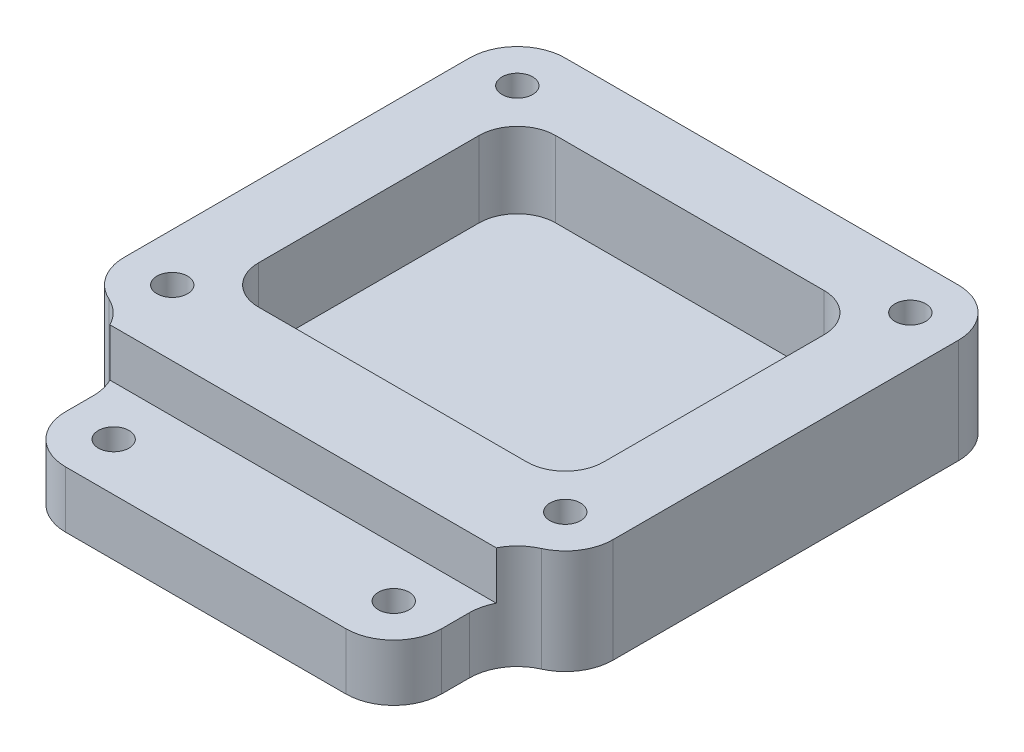
ISO-10303-21;
HEADER;
FILE_DESCRIPTION(('STEP AP214'),'2;1');
FILE_NAME('part.step','',(''),(''),'','','');
FILE_SCHEMA(('AUTOMOTIVE_DESIGN { 1 0 10303 214 1 1 1 1 }'));
ENDSEC;
DATA;
#1=APPLICATION_CONTEXT('core data for automotive mechanical design processes');
#2=APPLICATION_PROTOCOL_DEFINITION('international standard','automotive_design',2000,#1);
#3=PRODUCT_CONTEXT('',#1,'mechanical');
#4=PRODUCT('Part','Part','',(#3));
#5=PRODUCT_RELATED_PRODUCT_CATEGORY('part','',(#4));
#6=PRODUCT_DEFINITION_FORMATION('','',#4);
#7=PRODUCT_DEFINITION_CONTEXT('part definition',#1,'design');
#8=PRODUCT_DEFINITION('design','',#6,#7);
#9=PRODUCT_DEFINITION_SHAPE('','',#8);
#10=(LENGTH_UNIT() NAMED_UNIT(*) SI_UNIT(.MILLI.,.METRE.));
#11=(NAMED_UNIT(*) PLANE_ANGLE_UNIT() SI_UNIT($,.RADIAN.));
#12=(NAMED_UNIT(*) SI_UNIT($,.STERADIAN.) SOLID_ANGLE_UNIT());
#13=UNCERTAINTY_MEASURE_WITH_UNIT(LENGTH_MEASURE(1.E-05),#10,'distance_accuracy_value','');
#14=(GEOMETRIC_REPRESENTATION_CONTEXT(3) GLOBAL_UNCERTAINTY_ASSIGNED_CONTEXT((#13)) GLOBAL_UNIT_ASSIGNED_CONTEXT((#10,
#11,#12)) REPRESENTATION_CONTEXT('',''));
#15=CARTESIAN_POINT('',(0.,0.,0.));
#16=DIRECTION('',(0.,0.,1.));
#17=DIRECTION('',(1.,0.,0.));
#18=AXIS2_PLACEMENT_3D('',#15,#16,#17);
#19=CARTESIAN_POINT('',(-19.61,10.9,0.));
#20=DIRECTION('',(-1.,0.,0.));
#21=DIRECTION('',(0.,0.,1.));
#22=AXIS2_PLACEMENT_3D('',#19,#20,#21);
#23=PLANE('',#22);
#24=DIRECTION('',(0.,0.,1.));
#25=VECTOR('',#24,1.);
#26=CARTESIAN_POINT('',(-19.61,5.9,35.15));
#27=LINE('',#26,#25);
#28=CARTESIAN_POINT('',(-19.61,5.9,27.1163534376416));
#29=VERTEX_POINT('',#28);
#30=CARTESIAN_POINT('',(-19.61,5.9,30.));
#31=VERTEX_POINT('',#30);
#32=EDGE_CURVE('E413',#29,#31,#27,.T.);
#33=ORIENTED_EDGE('',*,*,#32,.F.);
#34=DIRECTION('',(0.,-1.,0.));
#35=VECTOR('',#34,1.);
#36=CARTESIAN_POINT('',(-19.61,0.,27.1163534376416));
#37=LINE('',#36,#35);
#38=CARTESIAN_POINT('',(-19.61,0.,27.1163534376416));
#39=VERTEX_POINT('',#38);
#40=EDGE_CURVE('E310',#29,#39,#37,.T.);
#41=ORIENTED_EDGE('',*,*,#40,.T.);
#42=DIRECTION('',(0.,0.,-1.));
#43=VECTOR('',#42,1.);
#44=CARTESIAN_POINT('',(-19.61,0.,0.));
#45=LINE('',#44,#43);
#46=CARTESIAN_POINT('',(-19.61,0.,30.));
#47=VERTEX_POINT('',#46);
#48=EDGE_CURVE('E403',#47,#39,#45,.T.);
#49=ORIENTED_EDGE('',*,*,#48,.F.);
#50=DIRECTION('',(0.,-1.,0.));
#51=VECTOR('',#50,1.);
#52=CARTESIAN_POINT('',(-19.61,5.9,30.));
#53=LINE('',#52,#51);
#54=EDGE_CURVE('E207',#47,#31,#53,.F.);
#55=ORIENTED_EDGE('',*,*,#54,.T.);
#56=EDGE_LOOP('',(#33,#41,#49,#55));
#57=FACE_BOUND('',#56,.T.);
#58=ADVANCED_FACE('F36',(#57),#23,.T.);
#59=CARTESIAN_POINT('',(0.,10.9,35.));
#60=DIRECTION('',(0.,0.,-1.));
#61=DIRECTION('',(-1.,0.,0.));
#62=AXIS2_PLACEMENT_3D('',#59,#60,#61);
#63=PLANE('',#62);
#64=DIRECTION('',(1.,0.,0.));
#65=VECTOR('',#64,1.);
#66=CARTESIAN_POINT('',(0.,0.,35.));
#67=LINE('',#66,#65);
#68=CARTESIAN_POINT('',(-14.61,0.,35.));
#69=VERTEX_POINT('',#68);
#70=CARTESIAN_POINT('',(14.61,0.,35.));
#71=VERTEX_POINT('',#70);
#72=EDGE_CURVE('E360',#69,#71,#67,.T.);
#73=ORIENTED_EDGE('',*,*,#72,.T.);
#74=DIRECTION('',(0.,-1.,0.));
#75=VECTOR('',#74,1.);
#76=CARTESIAN_POINT('',(14.61,10.9,35.));
#77=LINE('',#76,#75);
#78=CARTESIAN_POINT('',(14.61,5.9,35.));
#79=VERTEX_POINT('',#78);
#80=EDGE_CURVE('E245',#71,#79,#77,.F.);
#81=ORIENTED_EDGE('',*,*,#80,.T.);
#82=DIRECTION('',(-1.,0.,0.));
#83=VECTOR('',#82,1.);
#84=CARTESIAN_POINT('',(0.,5.9,35.));
#85=LINE('',#84,#83);
#86=CARTESIAN_POINT('',(-14.61,5.9,35.));
#87=VERTEX_POINT('',#86);
#88=EDGE_CURVE('E203',#79,#87,#85,.T.);
#89=ORIENTED_EDGE('',*,*,#88,.T.);
#90=DIRECTION('',(0.,-1.,0.));
#91=VECTOR('',#90,1.);
#92=CARTESIAN_POINT('',(-14.61,0.,35.));
#93=LINE('',#92,#91);
#94=EDGE_CURVE('E242',#87,#69,#93,.T.);
#95=ORIENTED_EDGE('',*,*,#94,.T.);
#96=EDGE_LOOP('',(#73,#81,#89,#95));
#97=FACE_BOUND('',#96,.T.);
#98=ADVANCED_FACE('F408',(#97),#63,.F.);
#99=CARTESIAN_POINT('',(19.61,10.9,0.));
#100=DIRECTION('',(-1.,0.,0.));
#101=DIRECTION('',(0.,0.,1.));
#102=AXIS2_PLACEMENT_3D('',#99,#100,#101);
#103=PLANE('',#102);
#104=DIRECTION('',(0.,0.,-1.));
#105=VECTOR('',#104,1.);
#106=CARTESIAN_POINT('',(19.61,0.,0.));
#107=LINE('',#106,#105);
#108=CARTESIAN_POINT('',(19.61,0.,30.));
#109=VERTEX_POINT('',#108);
#110=CARTESIAN_POINT('',(19.61,0.,27.1163534376416));
#111=VERTEX_POINT('',#110);
#112=EDGE_CURVE('E356',#109,#111,#107,.T.);
#113=ORIENTED_EDGE('',*,*,#112,.T.);
#114=DIRECTION('',(0.,-1.,0.));
#115=VECTOR('',#114,1.);
#116=CARTESIAN_POINT('',(19.61,10.9,27.1163534376416));
#117=LINE('',#116,#115);
#118=CARTESIAN_POINT('',(19.61,5.9,27.1163534376416));
#119=VERTEX_POINT('',#118);
#120=EDGE_CURVE('E217',#111,#119,#117,.F.);
#121=ORIENTED_EDGE('',*,*,#120,.T.);
#122=DIRECTION('',(0.,0.,-1.));
#123=VECTOR('',#122,1.);
#124=CARTESIAN_POINT('',(19.61,5.9,35.15));
#125=LINE('',#124,#123);
#126=CARTESIAN_POINT('',(19.61,5.9,30.));
#127=VERTEX_POINT('',#126);
#128=EDGE_CURVE('E200',#127,#119,#125,.T.);
#129=ORIENTED_EDGE('',*,*,#128,.F.);
#130=DIRECTION('',(0.,-1.,0.));
#131=VECTOR('',#130,1.);
#132=CARTESIAN_POINT('',(19.61,10.9,30.));
#133=LINE('',#132,#131);
#134=EDGE_CURVE('E214',#127,#109,#133,.T.);
#135=ORIENTED_EDGE('',*,*,#134,.T.);
#136=EDGE_LOOP('',(#113,#121,#129,#135));
#137=FACE_BOUND('',#136,.T.);
#138=ADVANCED_FACE('F213',(#137),#103,.F.);
#139=CARTESIAN_POINT('',(25.5,10.9,0.));
#140=DIRECTION('',(-1.,0.,0.));
#141=DIRECTION('',(0.,0.,1.));
#142=AXIS2_PLACEMENT_3D('',#139,#140,#141);
#143=PLANE('',#142);
#144=DIRECTION('',(0.,0.,-1.));
#145=VECTOR('',#144,1.);
#146=CARTESIAN_POINT('',(25.5,0.,0.));
#147=LINE('',#146,#145);
#148=CARTESIAN_POINT('',(25.5,0.,18.));
#149=VERTEX_POINT('',#148);
#150=CARTESIAN_POINT('',(25.5,0.,-18.));
#151=VERTEX_POINT('',#150);
#152=EDGE_CURVE('E348',#149,#151,#147,.T.);
#153=ORIENTED_EDGE('',*,*,#152,.T.);
#154=DIRECTION('',(0.,-1.,0.));
#155=VECTOR('',#154,1.);
#156=CARTESIAN_POINT('',(25.5,10.9,-18.));
#157=LINE('',#156,#155);
#158=CARTESIAN_POINT('',(25.5,10.9,-18.));
#159=VERTEX_POINT('',#158);
#160=EDGE_CURVE('E272',#151,#159,#157,.F.);
#161=ORIENTED_EDGE('',*,*,#160,.T.);
#162=DIRECTION('',(0.,0.,-1.));
#163=VECTOR('',#162,1.);
#164=CARTESIAN_POINT('',(25.5,10.9,0.));
#165=LINE('',#164,#163);
#166=CARTESIAN_POINT('',(25.5,10.9,18.));
#167=VERTEX_POINT('',#166);
#168=EDGE_CURVE('E350',#167,#159,#165,.T.);
#169=ORIENTED_EDGE('',*,*,#168,.F.);
#170=DIRECTION('',(0.,-1.,0.));
#171=VECTOR('',#170,1.);
#172=CARTESIAN_POINT('',(25.5,10.9,18.));
#173=LINE('',#172,#171);
#174=EDGE_CURVE('E269',#167,#149,#173,.T.);
#175=ORIENTED_EDGE('',*,*,#174,.T.);
#176=EDGE_LOOP('',(#153,#161,#169,#175));
#177=FACE_BOUND('',#176,.T.);
#178=ADVANCED_FACE('F347',(#177),#143,.F.);
#179=CARTESIAN_POINT('',(0.,10.9,-23.));
#180=DIRECTION('',(0.,0.,-1.));
#181=DIRECTION('',(-1.,0.,0.));
#182=AXIS2_PLACEMENT_3D('',#179,#180,#181);
#183=PLANE('',#182);
#184=DIRECTION('',(1.,0.,0.));
#185=VECTOR('',#184,1.);
#186=CARTESIAN_POINT('',(0.,0.,-23.));
#187=LINE('',#186,#185);
#188=CARTESIAN_POINT('',(-20.5,0.,-23.));
#189=VERTEX_POINT('',#188);
#190=CARTESIAN_POINT('',(20.5,0.,-23.));
#191=VERTEX_POINT('',#190);
#192=EDGE_CURVE('E355',#189,#191,#187,.T.);
#193=ORIENTED_EDGE('',*,*,#192,.F.);
#194=DIRECTION('',(0.,-1.,0.));
#195=VECTOR('',#194,1.);
#196=CARTESIAN_POINT('',(-20.5,10.9,-23.));
#197=LINE('',#196,#195);
#198=CARTESIAN_POINT('',(-20.5,10.9,-23.));
#199=VERTEX_POINT('',#198);
#200=EDGE_CURVE('E267',#189,#199,#197,.F.);
#201=ORIENTED_EDGE('',*,*,#200,.T.);
#202=DIRECTION('',(1.,0.,0.));
#203=VECTOR('',#202,1.);
#204=CARTESIAN_POINT('',(0.,10.9,-23.));
#205=LINE('',#204,#203);
#206=CARTESIAN_POINT('',(20.5,10.9,-23.));
#207=VERTEX_POINT('',#206);
#208=EDGE_CURVE('E389',#199,#207,#205,.T.);
#209=ORIENTED_EDGE('',*,*,#208,.T.);
#210=DIRECTION('',(0.,-1.,0.));
#211=VECTOR('',#210,1.);
#212=CARTESIAN_POINT('',(20.5,0.,-23.));
#213=LINE('',#212,#211);
#214=EDGE_CURVE('E264',#207,#191,#213,.T.);
#215=ORIENTED_EDGE('',*,*,#214,.T.);
#216=EDGE_LOOP('',(#193,#201,#209,#215));
#217=FACE_BOUND('',#216,.T.);
#218=ADVANCED_FACE('F439',(#217),#183,.T.);
#219=CARTESIAN_POINT('',(14.61,10.9,30.));
#220=DIRECTION('',(0.,-1.,0.));
#221=DIRECTION('',(0.,0.,-1.));
#222=AXIS2_PLACEMENT_3D('',#219,#220,#221);
#223=CYLINDRICAL_SURFACE('',#222,1.6);
#224=CARTESIAN_POINT('',(14.61,5.9,30.));
#225=DIRECTION('',(0.,-1.,0.));
#226=DIRECTION('',(0.,0.,-1.));
#227=AXIS2_PLACEMENT_3D('',#224,#225,#226);
#228=CIRCLE('',#227,1.6);
#229=CARTESIAN_POINT('',(14.61,5.9,28.4));
#230=VERTEX_POINT('',#229);
#231=EDGE_CURVE('E738',#230,#230,#228,.T.);
#232=ORIENTED_EDGE('',*,*,#231,.F.);
#233=EDGE_LOOP('',(#232));
#234=FACE_BOUND('',#233,.T.);
#235=CARTESIAN_POINT('',(14.61,0.,30.));
#236=DIRECTION('',(0.,1.,0.));
#237=DIRECTION('',(0.,0.,1.));
#238=AXIS2_PLACEMENT_3D('',#235,#236,#237);
#239=CIRCLE('',#238,1.6);
#240=CARTESIAN_POINT('',(14.61,0.,31.6));
#241=VERTEX_POINT('',#240);
#242=EDGE_CURVE('E372',#241,#241,#239,.T.);
#243=ORIENTED_EDGE('',*,*,#242,.F.);
#244=EDGE_LOOP('',(#243));
#245=FACE_BOUND('',#244,.T.);
#246=ADVANCED_FACE('F663',(#234,#245),#223,.F.);
#247=CARTESIAN_POINT('',(20.5,10.9,18.));
#248=DIRECTION('',(0.,-1.,0.));
#249=DIRECTION('',(0.,0.,-1.));
#250=AXIS2_PLACEMENT_3D('',#247,#248,#249);
#251=CYLINDRICAL_SURFACE('',#250,1.6);
#252=CARTESIAN_POINT('',(20.5,10.9,18.));
#253=DIRECTION('',(0.,1.,0.));
#254=DIRECTION('',(0.,0.,1.));
#255=AXIS2_PLACEMENT_3D('',#252,#253,#254);
#256=CIRCLE('',#255,1.6);
#257=CARTESIAN_POINT('',(20.5,10.9,19.6));
#258=VERTEX_POINT('',#257);
#259=EDGE_CURVE('E222',#258,#258,#256,.F.);
#260=ORIENTED_EDGE('',*,*,#259,.F.);
#261=EDGE_LOOP('',(#260));
#262=FACE_BOUND('',#261,.T.);
#263=CARTESIAN_POINT('',(20.5,0.,18.));
#264=DIRECTION('',(0.,1.,0.));
#265=DIRECTION('',(0.,0.,1.));
#266=AXIS2_PLACEMENT_3D('',#263,#264,#265);
#267=CIRCLE('',#266,1.6);
#268=CARTESIAN_POINT('',(20.5,0.,19.6));
#269=VERTEX_POINT('',#268);
#270=EDGE_CURVE('E369',#269,#269,#267,.F.);
#271=ORIENTED_EDGE('',*,*,#270,.T.);
#272=EDGE_LOOP('',(#271));
#273=FACE_BOUND('',#272,.T.);
#274=ADVANCED_FACE('F692',(#262,#273),#251,.F.);
#275=CARTESIAN_POINT('',(-20.5,10.9,18.));
#276=DIRECTION('',(0.,-1.,0.));
#277=DIRECTION('',(0.,0.,-1.));
#278=AXIS2_PLACEMENT_3D('',#275,#276,#277);
#279=CYLINDRICAL_SURFACE('',#278,1.6);
#280=CARTESIAN_POINT('',(-20.5,10.9,18.));
#281=DIRECTION('',(0.,1.,0.));
#282=DIRECTION('',(0.,0.,1.));
#283=AXIS2_PLACEMENT_3D('',#280,#281,#282);
#284=CIRCLE('',#283,1.6);
#285=CARTESIAN_POINT('',(-20.5,10.9,19.6));
#286=VERTEX_POINT('',#285);
#287=EDGE_CURVE('E228',#286,#286,#284,.T.);
#288=ORIENTED_EDGE('',*,*,#287,.T.);
#289=EDGE_LOOP('',(#288));
#290=FACE_BOUND('',#289,.T.);
#291=CARTESIAN_POINT('',(-20.5,0.,18.));
#292=DIRECTION('',(0.,1.,0.));
#293=DIRECTION('',(0.,0.,1.));
#294=AXIS2_PLACEMENT_3D('',#291,#292,#293);
#295=CIRCLE('',#294,1.6);
#296=CARTESIAN_POINT('',(-20.5,0.,19.6));
#297=VERTEX_POINT('',#296);
#298=EDGE_CURVE('E366',#297,#297,#295,.T.);
#299=ORIENTED_EDGE('',*,*,#298,.F.);
#300=EDGE_LOOP('',(#299));
#301=FACE_BOUND('',#300,.T.);
#302=ADVANCED_FACE('F651',(#290,#301),#279,.F.);
#303=CARTESIAN_POINT('',(-25.5,10.9,0.));
#304=DIRECTION('',(-1.,0.,0.));
#305=DIRECTION('',(0.,0.,1.));
#306=AXIS2_PLACEMENT_3D('',#303,#304,#305);
#307=PLANE('',#306);
#308=DIRECTION('',(0.,0.,-1.));
#309=VECTOR('',#308,1.);
#310=CARTESIAN_POINT('',(-25.5,0.,0.));
#311=LINE('',#310,#309);
#312=CARTESIAN_POINT('',(-25.5,0.,18.));
#313=VERTEX_POINT('',#312);
#314=CARTESIAN_POINT('',(-25.5,0.,-18.));
#315=VERTEX_POINT('',#314);
#316=EDGE_CURVE('E358',#313,#315,#311,.T.);
#317=ORIENTED_EDGE('',*,*,#316,.F.);
#318=DIRECTION('',(0.,-1.,0.));
#319=VECTOR('',#318,1.);
#320=CARTESIAN_POINT('',(-25.5,10.9,18.));
#321=LINE('',#320,#319);
#322=CARTESIAN_POINT('',(-25.5,10.9,18.));
#323=VERTEX_POINT('',#322);
#324=EDGE_CURVE('E253',#313,#323,#321,.F.);
#325=ORIENTED_EDGE('',*,*,#324,.T.);
#326=DIRECTION('',(0.,0.,-1.));
#327=VECTOR('',#326,1.);
#328=CARTESIAN_POINT('',(-25.5,10.9,0.));
#329=LINE('',#328,#327);
#330=CARTESIAN_POINT('',(-25.5,10.9,-18.));
#331=VERTEX_POINT('',#330);
#332=EDGE_CURVE('E392',#323,#331,#329,.T.);
#333=ORIENTED_EDGE('',*,*,#332,.T.);
#334=DIRECTION('',(0.,-1.,0.));
#335=VECTOR('',#334,1.);
#336=CARTESIAN_POINT('',(-25.5,10.9,-18.));
#337=LINE('',#336,#335);
#338=EDGE_CURVE('E250',#331,#315,#337,.T.);
#339=ORIENTED_EDGE('',*,*,#338,.T.);
#340=EDGE_LOOP('',(#317,#325,#333,#339));
#341=FACE_BOUND('',#340,.T.);
#342=ADVANCED_FACE('F433',(#341),#307,.T.);
#343=CARTESIAN_POINT('',(20.5,10.9,-18.));
#344=DIRECTION('',(0.,-1.,0.));
#345=DIRECTION('',(0.,0.,-1.));
#346=AXIS2_PLACEMENT_3D('',#343,#344,#345);
#347=CYLINDRICAL_SURFACE('',#346,1.6);
#348=CARTESIAN_POINT('',(20.5,10.9,-18.));
#349=DIRECTION('',(0.,1.,0.));
#350=DIRECTION('',(0.,0.,1.));
#351=AXIS2_PLACEMENT_3D('',#348,#349,#350);
#352=CIRCLE('',#351,1.6);
#353=CARTESIAN_POINT('',(20.5,10.9,-16.4));
#354=VERTEX_POINT('',#353);
#355=EDGE_CURVE('E380',#354,#354,#352,.T.);
#356=ORIENTED_EDGE('',*,*,#355,.T.);
#357=EDGE_LOOP('',(#356));
#358=FACE_BOUND('',#357,.T.);
#359=CARTESIAN_POINT('',(20.5,0.,-18.));
#360=DIRECTION('',(0.,1.,0.));
#361=DIRECTION('',(0.,0.,1.));
#362=AXIS2_PLACEMENT_3D('',#359,#360,#361);
#363=CIRCLE('',#362,1.6);
#364=CARTESIAN_POINT('',(20.5,0.,-16.4));
#365=VERTEX_POINT('',#364);
#366=EDGE_CURVE('E400',#365,#365,#363,.T.);
#367=ORIENTED_EDGE('',*,*,#366,.F.);
#368=EDGE_LOOP('',(#367));
#369=FACE_BOUND('',#368,.T.);
#370=ADVANCED_FACE('F461',(#358,#369),#347,.F.);
#371=CARTESIAN_POINT('',(-20.5,10.9,-18.));
#372=DIRECTION('',(0.,-1.,0.));
#373=DIRECTION('',(0.,0.,-1.));
#374=AXIS2_PLACEMENT_3D('',#371,#372,#373);
#375=CYLINDRICAL_SURFACE('',#374,1.6);
#376=CARTESIAN_POINT('',(-20.5,10.9,-18.));
#377=DIRECTION('',(0.,1.,0.));
#378=DIRECTION('',(0.,0.,1.));
#379=AXIS2_PLACEMENT_3D('',#376,#377,#378);
#380=CIRCLE('',#379,1.6);
#381=CARTESIAN_POINT('',(-20.5,10.9,-16.4));
#382=VERTEX_POINT('',#381);
#383=EDGE_CURVE('E376',#382,#382,#380,.F.);
#384=ORIENTED_EDGE('',*,*,#383,.F.);
#385=EDGE_LOOP('',(#384));
#386=FACE_BOUND('',#385,.T.);
#387=CARTESIAN_POINT('',(-20.5,0.,-18.));
#388=DIRECTION('',(0.,1.,0.));
#389=DIRECTION('',(0.,0.,1.));
#390=AXIS2_PLACEMENT_3D('',#387,#388,#389);
#391=CIRCLE('',#390,1.6);
#392=CARTESIAN_POINT('',(-20.5,0.,-16.4));
#393=VERTEX_POINT('',#392);
#394=EDGE_CURVE('E397',#393,#393,#391,.F.);
#395=ORIENTED_EDGE('',*,*,#394,.T.);
#396=EDGE_LOOP('',(#395));
#397=FACE_BOUND('',#396,.T.);
#398=ADVANCED_FACE('F464',(#386,#397),#375,.F.);
#399=CARTESIAN_POINT('',(-14.61,10.9,30.));
#400=DIRECTION('',(0.,-1.,0.));
#401=DIRECTION('',(0.,0.,-1.));
#402=AXIS2_PLACEMENT_3D('',#399,#400,#401);
#403=CYLINDRICAL_SURFACE('',#402,1.6);
#404=CARTESIAN_POINT('',(-14.61,5.9,30.));
#405=DIRECTION('',(0.,-1.,0.));
#406=DIRECTION('',(0.,0.,-1.));
#407=AXIS2_PLACEMENT_3D('',#404,#405,#406);
#408=CIRCLE('',#407,1.6);
#409=CARTESIAN_POINT('',(-14.61,5.9,28.4));
#410=VERTEX_POINT('',#409);
#411=EDGE_CURVE('E231',#410,#410,#408,.F.);
#412=ORIENTED_EDGE('',*,*,#411,.T.);
#413=EDGE_LOOP('',(#412));
#414=FACE_BOUND('',#413,.T.);
#415=CARTESIAN_POINT('',(-14.61,0.,30.));
#416=DIRECTION('',(0.,1.,0.));
#417=DIRECTION('',(0.,0.,1.));
#418=AXIS2_PLACEMENT_3D('',#415,#416,#417);
#419=CIRCLE('',#418,1.6);
#420=CARTESIAN_POINT('',(-14.61,0.,31.6));
#421=VERTEX_POINT('',#420);
#422=EDGE_CURVE('E374',#421,#421,#419,.F.);
#423=ORIENTED_EDGE('',*,*,#422,.T.);
#424=EDGE_LOOP('',(#423));
#425=FACE_BOUND('',#424,.T.);
#426=ADVANCED_FACE('F468',(#414,#425),#403,.F.);
#427=CARTESIAN_POINT('',(0.,10.9,0.));
#428=DIRECTION('',(0.,1.,0.));
#429=DIRECTION('',(0.,0.,1.));
#430=AXIS2_PLACEMENT_3D('',#427,#428,#429);
#431=PLANE('',#430);
#432=DIRECTION('',(0.,0.,-1.));
#433=VECTOR('',#432,1.);
#434=CARTESIAN_POINT('',(18.,10.9,15.5));
#435=LINE('',#434,#433);
#436=CARTESIAN_POINT('',(18.,10.9,11.5));
#437=VERTEX_POINT('',#436);
#438=CARTESIAN_POINT('',(18.,10.9,-11.5));
#439=VERTEX_POINT('',#438);
#440=EDGE_CURVE('E754',#437,#439,#435,.T.);
#441=ORIENTED_EDGE('',*,*,#440,.F.);
#442=CARTESIAN_POINT('',(14.,10.9,11.5));
#443=DIRECTION('',(0.,1.,0.));
#444=DIRECTION('',(0.,0.,1.));
#445=AXIS2_PLACEMENT_3D('',#442,#443,#444);
#446=CIRCLE('',#445,4.);
#447=CARTESIAN_POINT('',(14.,10.9,15.5));
#448=VERTEX_POINT('',#447);
#449=EDGE_CURVE('E302',#437,#448,#446,.F.);
#450=ORIENTED_EDGE('',*,*,#449,.T.);
#451=DIRECTION('',(1.,0.,0.));
#452=VECTOR('',#451,1.);
#453=CARTESIAN_POINT('',(-18.,10.9,15.5));
#454=LINE('',#453,#452);
#455=CARTESIAN_POINT('',(-14.,10.9,15.5));
#456=VERTEX_POINT('',#455);
#457=EDGE_CURVE('E744',#456,#448,#454,.T.);
#458=ORIENTED_EDGE('',*,*,#457,.F.);
#459=CARTESIAN_POINT('',(-14.,10.9,11.5));
#460=DIRECTION('',(0.,1.,0.));
#461=DIRECTION('',(0.,0.,1.));
#462=AXIS2_PLACEMENT_3D('',#459,#460,#461);
#463=CIRCLE('',#462,4.);
#464=CARTESIAN_POINT('',(-18.,10.9,11.5));
#465=VERTEX_POINT('',#464);
#466=EDGE_CURVE('E306',#456,#465,#463,.F.);
#467=ORIENTED_EDGE('',*,*,#466,.T.);
#468=DIRECTION('',(0.,0.,1.));
#469=VECTOR('',#468,1.);
#470=CARTESIAN_POINT('',(-18.,10.9,15.5));
#471=LINE('',#470,#469);
#472=CARTESIAN_POINT('',(-18.,10.9,-11.5));
#473=VERTEX_POINT('',#472);
#474=EDGE_CURVE('E748',#473,#465,#471,.T.);
#475=ORIENTED_EDGE('',*,*,#474,.F.);
#476=CARTESIAN_POINT('',(-14.,10.9,-11.5));
#477=DIRECTION('',(0.,1.,0.));
#478=DIRECTION('',(0.,0.,1.));
#479=AXIS2_PLACEMENT_3D('',#476,#477,#478);
#480=CIRCLE('',#479,4.);
#481=CARTESIAN_POINT('',(-14.,10.9,-15.5));
#482=VERTEX_POINT('',#481);
#483=EDGE_CURVE('E308',#473,#482,#480,.F.);
#484=ORIENTED_EDGE('',*,*,#483,.T.);
#485=DIRECTION('',(-1.,0.,0.));
#486=VECTOR('',#485,1.);
#487=CARTESIAN_POINT('',(-18.,10.9,-15.5));
#488=LINE('',#487,#486);
#489=CARTESIAN_POINT('',(14.,10.9,-15.5));
#490=VERTEX_POINT('',#489);
#491=EDGE_CURVE('E751',#490,#482,#488,.T.);
#492=ORIENTED_EDGE('',*,*,#491,.F.);
#493=CARTESIAN_POINT('',(14.,10.9,-11.5));
#494=DIRECTION('',(0.,1.,0.));
#495=DIRECTION('',(0.,0.,1.));
#496=AXIS2_PLACEMENT_3D('',#493,#494,#495);
#497=CIRCLE('',#496,4.);
#498=EDGE_CURVE('E304',#490,#439,#497,.F.);
#499=ORIENTED_EDGE('',*,*,#498,.T.);
#500=EDGE_LOOP('',(#441,#450,#458,#467,#475,#484,#492,#499));
#501=FACE_BOUND('',#500,.T.);
#502=ORIENTED_EDGE('',*,*,#332,.F.);
#503=CARTESIAN_POINT('',(-20.5,10.9,18.));
#504=DIRECTION('',(0.,1.,0.));
#505=DIRECTION('',(0.,0.,1.));
#506=AXIS2_PLACEMENT_3D('',#503,#504,#505);
#507=CIRCLE('',#506,5.);
#508=CARTESIAN_POINT('',(-22.555,10.9,22.5581767188208));
#509=VERTEX_POINT('',#508);
#510=EDGE_CURVE('E261',#323,#509,#507,.T.);
#511=ORIENTED_EDGE('',*,*,#510,.T.);
#512=CARTESIAN_POINT('',(-24.61,10.9,27.1163534376416));
#513=DIRECTION('',(0.,1.,0.));
#514=DIRECTION('',(0.,0.,1.));
#515=AXIS2_PLACEMENT_3D('',#512,#513,#514);
#516=CIRCLE('',#515,5.);
#517=CARTESIAN_POINT('',(-20.1531353963027,10.9,24.85));
#518=VERTEX_POINT('',#517);
#519=EDGE_CURVE('E321',#509,#518,#516,.F.);
#520=ORIENTED_EDGE('',*,*,#519,.T.);
#521=DIRECTION('',(-1.,0.,0.));
#522=VECTOR('',#521,1.);
#523=CARTESIAN_POINT('',(-19.61,10.9,24.85));
#524=LINE('',#523,#522);
#525=CARTESIAN_POINT('',(20.1531353963027,10.9,24.85));
#526=VERTEX_POINT('',#525);
#527=EDGE_CURVE('E50',#526,#518,#524,.T.);
#528=ORIENTED_EDGE('',*,*,#527,.F.);
#529=CARTESIAN_POINT('',(24.61,10.9,27.1163534376416));
#530=DIRECTION('',(0.,1.,0.));
#531=DIRECTION('',(0.,0.,1.));
#532=AXIS2_PLACEMENT_3D('',#529,#530,#531);
#533=CIRCLE('',#532,5.);
#534=CARTESIAN_POINT('',(22.555,10.9,22.5581767188208));
#535=VERTEX_POINT('',#534);
#536=EDGE_CURVE('E11',#526,#535,#533,.F.);
#537=ORIENTED_EDGE('',*,*,#536,.T.);
#538=CARTESIAN_POINT('',(20.5,10.9,18.));
#539=DIRECTION('',(0.,1.,0.));
#540=DIRECTION('',(0.,0.,1.));
#541=AXIS2_PLACEMENT_3D('',#538,#539,#540);
#542=CIRCLE('',#541,5.);
#543=EDGE_CURVE('E255',#535,#167,#542,.T.);
#544=ORIENTED_EDGE('',*,*,#543,.T.);
#545=ORIENTED_EDGE('',*,*,#168,.T.);
#546=CARTESIAN_POINT('',(20.5,10.9,-18.));
#547=DIRECTION('',(0.,1.,0.));
#548=DIRECTION('',(0.,0.,1.));
#549=AXIS2_PLACEMENT_3D('',#546,#547,#548);
#550=CIRCLE('',#549,5.);
#551=EDGE_CURVE('E257',#159,#207,#550,.T.);
#552=ORIENTED_EDGE('',*,*,#551,.T.);
#553=ORIENTED_EDGE('',*,*,#208,.F.);
#554=CARTESIAN_POINT('',(-20.5,10.9,-18.));
#555=DIRECTION('',(0.,1.,0.));
#556=DIRECTION('',(0.,0.,1.));
#557=AXIS2_PLACEMENT_3D('',#554,#555,#556);
#558=CIRCLE('',#557,5.);
#559=EDGE_CURVE('E259',#199,#331,#558,.T.);
#560=ORIENTED_EDGE('',*,*,#559,.T.);
#561=EDGE_LOOP('',(#502,#511,#520,#528,#537,#544,#545,#552,#553,#560));
#562=FACE_BOUND('',#561,.T.);
#563=ORIENTED_EDGE('',*,*,#383,.T.);
#564=EDGE_LOOP('',(#563));
#565=FACE_BOUND('',#564,.T.);
#566=ORIENTED_EDGE('',*,*,#355,.F.);
#567=EDGE_LOOP('',(#566));
#568=FACE_BOUND('',#567,.T.);
#569=ORIENTED_EDGE('',*,*,#287,.F.);
#570=EDGE_LOOP('',(#569));
#571=FACE_BOUND('',#570,.T.);
#572=ORIENTED_EDGE('',*,*,#259,.T.);
#573=EDGE_LOOP('',(#572));
#574=FACE_BOUND('',#573,.T.);
#575=ADVANCED_FACE('F337',(#501,#562,#565,#568,#571,#574),#431,.T.);
#576=CARTESIAN_POINT('',(0.,0.,0.));
#577=DIRECTION('',(0.,1.,0.));
#578=DIRECTION('',(0.,0.,1.));
#579=AXIS2_PLACEMENT_3D('',#576,#577,#578);
#580=PLANE('',#579);
#581=ORIENTED_EDGE('',*,*,#394,.F.);
#582=EDGE_LOOP('',(#581));
#583=FACE_BOUND('',#582,.T.);
#584=ORIENTED_EDGE('',*,*,#366,.T.);
#585=EDGE_LOOP('',(#584));
#586=FACE_BOUND('',#585,.T.);
#587=ORIENTED_EDGE('',*,*,#112,.F.);
#588=CARTESIAN_POINT('',(14.61,0.,30.));
#589=DIRECTION('',(0.,1.,0.));
#590=DIRECTION('',(0.,0.,1.));
#591=AXIS2_PLACEMENT_3D('',#588,#589,#590);
#592=CIRCLE('',#591,5.);
#593=EDGE_CURVE('E220',#109,#71,#592,.F.);
#594=ORIENTED_EDGE('',*,*,#593,.T.);
#595=ORIENTED_EDGE('',*,*,#72,.F.);
#596=CARTESIAN_POINT('',(-14.61,0.,30.));
#597=DIRECTION('',(0.,1.,0.));
#598=DIRECTION('',(0.,0.,1.));
#599=AXIS2_PLACEMENT_3D('',#596,#597,#598);
#600=CIRCLE('',#599,5.);
#601=EDGE_CURVE('E239',#69,#47,#600,.F.);
#602=ORIENTED_EDGE('',*,*,#601,.T.);
#603=ORIENTED_EDGE('',*,*,#48,.T.);
#604=CARTESIAN_POINT('',(-24.61,0.,27.1163534376416));
#605=DIRECTION('',(0.,1.,0.));
#606=DIRECTION('',(0.,0.,1.));
#607=AXIS2_PLACEMENT_3D('',#604,#605,#606);
#608=CIRCLE('',#607,5.);
#609=CARTESIAN_POINT('',(-22.555,0.,22.5581767188208));
#610=VERTEX_POINT('',#609);
#611=EDGE_CURVE('E319',#39,#610,#608,.T.);
#612=ORIENTED_EDGE('',*,*,#611,.T.);
#613=CARTESIAN_POINT('',(-20.5,0.,18.));
#614=DIRECTION('',(0.,1.,0.));
#615=DIRECTION('',(0.,0.,1.));
#616=AXIS2_PLACEMENT_3D('',#613,#614,#615);
#617=CIRCLE('',#616,5.);
#618=EDGE_CURVE('E237',#610,#313,#617,.F.);
#619=ORIENTED_EDGE('',*,*,#618,.T.);
#620=ORIENTED_EDGE('',*,*,#316,.T.);
#621=CARTESIAN_POINT('',(-20.5,0.,-18.));
#622=DIRECTION('',(0.,1.,0.));
#623=DIRECTION('',(0.,0.,1.));
#624=AXIS2_PLACEMENT_3D('',#621,#622,#623);
#625=CIRCLE('',#624,5.);
#626=EDGE_CURVE('E235',#315,#189,#625,.F.);
#627=ORIENTED_EDGE('',*,*,#626,.T.);
#628=ORIENTED_EDGE('',*,*,#192,.T.);
#629=CARTESIAN_POINT('',(20.5,0.,-18.));
#630=DIRECTION('',(0.,1.,0.));
#631=DIRECTION('',(0.,0.,1.));
#632=AXIS2_PLACEMENT_3D('',#629,#630,#631);
#633=CIRCLE('',#632,5.);
#634=EDGE_CURVE('E225',#191,#151,#633,.F.);
#635=ORIENTED_EDGE('',*,*,#634,.T.);
#636=ORIENTED_EDGE('',*,*,#152,.F.);
#637=CARTESIAN_POINT('',(20.5,0.,18.));
#638=DIRECTION('',(0.,1.,0.));
#639=DIRECTION('',(0.,0.,1.));
#640=AXIS2_PLACEMENT_3D('',#637,#638,#639);
#641=CIRCLE('',#640,5.);
#642=CARTESIAN_POINT('',(22.555,0.,22.5581767188208));
#643=VERTEX_POINT('',#642);
#644=EDGE_CURVE('E221',#149,#643,#641,.F.);
#645=ORIENTED_EDGE('',*,*,#644,.T.);
#646=CARTESIAN_POINT('',(24.61,0.,27.1163534376416));
#647=DIRECTION('',(0.,1.,0.));
#648=DIRECTION('',(0.,0.,1.));
#649=AXIS2_PLACEMENT_3D('',#646,#647,#648);
#650=CIRCLE('',#649,5.);
#651=EDGE_CURVE('E327',#643,#111,#650,.T.);
#652=ORIENTED_EDGE('',*,*,#651,.T.);
#653=EDGE_LOOP('',(#587,#594,#595,#602,#603,#612,#619,#620,#627,#628,#635,#636,#645,#652));
#654=FACE_BOUND('',#653,.T.);
#655=ORIENTED_EDGE('',*,*,#298,.T.);
#656=EDGE_LOOP('',(#655));
#657=FACE_BOUND('',#656,.T.);
#658=ORIENTED_EDGE('',*,*,#270,.F.);
#659=EDGE_LOOP('',(#658));
#660=FACE_BOUND('',#659,.T.);
#661=ORIENTED_EDGE('',*,*,#242,.T.);
#662=EDGE_LOOP('',(#661));
#663=FACE_BOUND('',#662,.T.);
#664=ORIENTED_EDGE('',*,*,#422,.F.);
#665=EDGE_LOOP('',(#664));
#666=FACE_BOUND('',#665,.T.);
#667=ADVANCED_FACE('F352',(#583,#586,#654,#657,#660,#663,#666),#580,.F.);
#668=CARTESIAN_POINT('',(0.,5.9,0.));
#669=DIRECTION('',(0.,-1.,0.));
#670=DIRECTION('',(0.,0.,-1.));
#671=AXIS2_PLACEMENT_3D('',#668,#669,#670);
#672=PLANE('',#671);
#673=ORIENTED_EDGE('',*,*,#231,.T.);
#674=EDGE_LOOP('',(#673));
#675=FACE_BOUND('',#674,.T.);
#676=ORIENTED_EDGE('',*,*,#411,.F.);
#677=EDGE_LOOP('',(#676));
#678=FACE_BOUND('',#677,.T.);
#679=ORIENTED_EDGE('',*,*,#88,.F.);
#680=CARTESIAN_POINT('',(14.61,5.9,30.));
#681=DIRECTION('',(0.,-1.,0.));
#682=DIRECTION('',(0.,0.,-1.));
#683=AXIS2_PLACEMENT_3D('',#680,#681,#682);
#684=CIRCLE('',#683,5.);
#685=EDGE_CURVE('E197',#79,#127,#684,.F.);
#686=ORIENTED_EDGE('',*,*,#685,.T.);
#687=ORIENTED_EDGE('',*,*,#128,.T.);
#688=CARTESIAN_POINT('',(24.61,5.9,27.1163534376416));
#689=DIRECTION('',(0.,-1.,0.));
#690=DIRECTION('',(0.,0.,-1.));
#691=AXIS2_PLACEMENT_3D('',#688,#689,#690);
#692=CIRCLE('',#691,5.);
#693=CARTESIAN_POINT('',(20.1531353963027,5.9,24.85));
#694=VERTEX_POINT('',#693);
#695=EDGE_CURVE('E329',#119,#694,#692,.T.);
#696=ORIENTED_EDGE('',*,*,#695,.T.);
#697=DIRECTION('',(-1.,0.,0.));
#698=VECTOR('',#697,1.);
#699=CARTESIAN_POINT('',(-19.61,5.9,24.85));
#700=LINE('',#699,#698);
#701=CARTESIAN_POINT('',(-20.1531353963027,5.9,24.85));
#702=VERTEX_POINT('',#701);
#703=EDGE_CURVE('E57',#694,#702,#700,.T.);
#704=ORIENTED_EDGE('',*,*,#703,.T.);
#705=CARTESIAN_POINT('',(-24.61,5.9,27.1163534376416));
#706=DIRECTION('',(0.,-1.,0.));
#707=DIRECTION('',(0.,0.,-1.));
#708=AXIS2_PLACEMENT_3D('',#705,#706,#707);
#709=CIRCLE('',#708,5.);
#710=EDGE_CURVE('E325',#702,#29,#709,.T.);
#711=ORIENTED_EDGE('',*,*,#710,.T.);
#712=ORIENTED_EDGE('',*,*,#32,.T.);
#713=CARTESIAN_POINT('',(-14.61,5.9,30.));
#714=DIRECTION('',(0.,-1.,0.));
#715=DIRECTION('',(0.,0.,-1.));
#716=AXIS2_PLACEMENT_3D('',#713,#714,#715);
#717=CIRCLE('',#716,5.);
#718=EDGE_CURVE('E208',#31,#87,#717,.F.);
#719=ORIENTED_EDGE('',*,*,#718,.T.);
#720=EDGE_LOOP('',(#679,#686,#687,#696,#704,#711,#712,#719));
#721=FACE_BOUND('',#720,.T.);
#722=ADVANCED_FACE('F199',(#675,#678,#721),#672,.F.);
#723=CARTESIAN_POINT('',(-19.61,5.9,24.85));
#724=DIRECTION('',(0.,0.,-1.));
#725=DIRECTION('',(-1.,0.,0.));
#726=AXIS2_PLACEMENT_3D('',#723,#724,#725);
#727=PLANE('',#726);
#728=ORIENTED_EDGE('',*,*,#527,.T.);
#729=DIRECTION('',(0.,1.,0.));
#730=VECTOR('',#729,1.);
#731=CARTESIAN_POINT('',(-20.1531353963027,10.9,24.85));
#732=LINE('',#731,#730);
#733=EDGE_CURVE('E323',#518,#702,#732,.F.);
#734=ORIENTED_EDGE('',*,*,#733,.T.);
#735=ORIENTED_EDGE('',*,*,#703,.F.);
#736=DIRECTION('',(0.,-1.,0.));
#737=VECTOR('',#736,1.);
#738=CARTESIAN_POINT('',(20.1531353963027,5.9,24.85));
#739=LINE('',#738,#737);
#740=EDGE_CURVE('E44',#694,#526,#739,.F.);
#741=ORIENTED_EDGE('',*,*,#740,.T.);
#742=EDGE_LOOP('',(#728,#734,#735,#741));
#743=FACE_BOUND('',#742,.T.);
#744=ADVANCED_FACE('F332',(#743),#727,.F.);
#745=CARTESIAN_POINT('',(14.61,10.9,30.));
#746=DIRECTION('',(0.,-1.,0.));
#747=DIRECTION('',(0.,0.,-1.));
#748=AXIS2_PLACEMENT_3D('',#745,#746,#747);
#749=CYLINDRICAL_SURFACE('',#748,5.);
#750=ORIENTED_EDGE('',*,*,#685,.F.);
#751=ORIENTED_EDGE('',*,*,#80,.F.);
#752=ORIENTED_EDGE('',*,*,#593,.F.);
#753=ORIENTED_EDGE('',*,*,#134,.F.);
#754=EDGE_LOOP('',(#750,#751,#752,#753));
#755=FACE_BOUND('',#754,.T.);
#756=ADVANCED_FACE('F219',(#755),#749,.T.);
#757=CARTESIAN_POINT('',(-14.61,10.9,30.));
#758=DIRECTION('',(0.,1.,0.));
#759=DIRECTION('',(0.,0.,1.));
#760=AXIS2_PLACEMENT_3D('',#757,#758,#759);
#761=CYLINDRICAL_SURFACE('',#760,5.);
#762=ORIENTED_EDGE('',*,*,#718,.F.);
#763=ORIENTED_EDGE('',*,*,#54,.F.);
#764=ORIENTED_EDGE('',*,*,#601,.F.);
#765=ORIENTED_EDGE('',*,*,#94,.F.);
#766=EDGE_LOOP('',(#762,#763,#764,#765));
#767=FACE_BOUND('',#766,.T.);
#768=ADVANCED_FACE('F472',(#767),#761,.T.);
#769=CARTESIAN_POINT('',(-20.5,10.9,18.));
#770=DIRECTION('',(0.,1.,0.));
#771=DIRECTION('',(0.,0.,1.));
#772=AXIS2_PLACEMENT_3D('',#769,#770,#771);
#773=CYLINDRICAL_SURFACE('',#772,5.);
#774=ORIENTED_EDGE('',*,*,#618,.F.);
#775=DIRECTION('',(0.,1.,0.));
#776=VECTOR('',#775,1.);
#777=CARTESIAN_POINT('',(-22.555,10.9,22.5581767188208));
#778=LINE('',#777,#776);
#779=EDGE_CURVE('E313',#610,#509,#778,.T.);
#780=ORIENTED_EDGE('',*,*,#779,.T.);
#781=ORIENTED_EDGE('',*,*,#510,.F.);
#782=ORIENTED_EDGE('',*,*,#324,.F.);
#783=EDGE_LOOP('',(#774,#780,#781,#782));
#784=FACE_BOUND('',#783,.T.);
#785=ADVANCED_FACE('F427',(#784),#773,.T.);
#786=CARTESIAN_POINT('',(-20.5,10.9,-18.));
#787=DIRECTION('',(0.,-1.,0.));
#788=DIRECTION('',(0.,0.,-1.));
#789=AXIS2_PLACEMENT_3D('',#786,#787,#788);
#790=CYLINDRICAL_SURFACE('',#789,5.);
#791=ORIENTED_EDGE('',*,*,#559,.F.);
#792=ORIENTED_EDGE('',*,*,#200,.F.);
#793=ORIENTED_EDGE('',*,*,#626,.F.);
#794=ORIENTED_EDGE('',*,*,#338,.F.);
#795=EDGE_LOOP('',(#791,#792,#793,#794));
#796=FACE_BOUND('',#795,.T.);
#797=ADVANCED_FACE('F435',(#796),#790,.T.);
#798=CARTESIAN_POINT('',(20.5,10.9,-18.));
#799=DIRECTION('',(0.,1.,0.));
#800=DIRECTION('',(0.,0.,1.));
#801=AXIS2_PLACEMENT_3D('',#798,#799,#800);
#802=CYLINDRICAL_SURFACE('',#801,5.);
#803=ORIENTED_EDGE('',*,*,#551,.F.);
#804=ORIENTED_EDGE('',*,*,#160,.F.);
#805=ORIENTED_EDGE('',*,*,#634,.F.);
#806=ORIENTED_EDGE('',*,*,#214,.F.);
#807=EDGE_LOOP('',(#803,#804,#805,#806));
#808=FACE_BOUND('',#807,.T.);
#809=ADVANCED_FACE('F443',(#808),#802,.T.);
#810=CARTESIAN_POINT('',(20.5,10.9,18.));
#811=DIRECTION('',(0.,-1.,0.));
#812=DIRECTION('',(0.,0.,-1.));
#813=AXIS2_PLACEMENT_3D('',#810,#811,#812);
#814=CYLINDRICAL_SURFACE('',#813,5.);
#815=ORIENTED_EDGE('',*,*,#543,.F.);
#816=DIRECTION('',(0.,-1.,0.));
#817=VECTOR('',#816,1.);
#818=CARTESIAN_POINT('',(22.555,10.9,22.5581767188208));
#819=LINE('',#818,#817);
#820=EDGE_CURVE('E315',#535,#643,#819,.T.);
#821=ORIENTED_EDGE('',*,*,#820,.T.);
#822=ORIENTED_EDGE('',*,*,#644,.F.);
#823=ORIENTED_EDGE('',*,*,#174,.F.);
#824=EDGE_LOOP('',(#815,#821,#822,#823));
#825=FACE_BOUND('',#824,.T.);
#826=ADVANCED_FACE('F343',(#825),#814,.T.);
#827=CARTESIAN_POINT('',(18.,3.,15.5));
#828=DIRECTION('',(1.,0.,0.));
#829=DIRECTION('',(0.,0.,-1.));
#830=AXIS2_PLACEMENT_3D('',#827,#828,#829);
#831=PLANE('',#830);
#832=DIRECTION('',(0.,0.,-1.));
#833=VECTOR('',#832,1.);
#834=CARTESIAN_POINT('',(18.,3.,15.5));
#835=LINE('',#834,#833);
#836=CARTESIAN_POINT('',(18.,3.,11.5));
#837=VERTEX_POINT('',#836);
#838=CARTESIAN_POINT('',(18.,3.,-11.5));
#839=VERTEX_POINT('',#838);
#840=EDGE_CURVE('E747',#837,#839,#835,.T.);
#841=ORIENTED_EDGE('',*,*,#840,.F.);
#842=DIRECTION('',(0.,1.,0.));
#843=VECTOR('',#842,1.);
#844=CARTESIAN_POINT('',(18.,10.9,11.5));
#845=LINE('',#844,#843);
#846=EDGE_CURVE('E276',#837,#437,#845,.T.);
#847=ORIENTED_EDGE('',*,*,#846,.T.);
#848=ORIENTED_EDGE('',*,*,#440,.T.);
#849=DIRECTION('',(0.,1.,0.));
#850=VECTOR('',#849,1.);
#851=CARTESIAN_POINT('',(18.,3.,-11.5));
#852=LINE('',#851,#850);
#853=EDGE_CURVE('E274',#439,#839,#852,.F.);
#854=ORIENTED_EDGE('',*,*,#853,.T.);
#855=EDGE_LOOP('',(#841,#847,#848,#854));
#856=FACE_BOUND('',#855,.T.);
#857=ADVANCED_FACE('F450',(#856),#831,.F.);
#858=CARTESIAN_POINT('',(-18.,3.,15.5));
#859=DIRECTION('',(0.,0.,1.));
#860=DIRECTION('',(1.,0.,0.));
#861=AXIS2_PLACEMENT_3D('',#858,#859,#860);
#862=PLANE('',#861);
#863=ORIENTED_EDGE('',*,*,#457,.T.);
#864=DIRECTION('',(0.,1.,0.));
#865=VECTOR('',#864,1.);
#866=CARTESIAN_POINT('',(14.,3.,15.5));
#867=LINE('',#866,#865);
#868=CARTESIAN_POINT('',(14.,3.,15.5));
#869=VERTEX_POINT('',#868);
#870=EDGE_CURVE('E282',#448,#869,#867,.F.);
#871=ORIENTED_EDGE('',*,*,#870,.T.);
#872=DIRECTION('',(1.,0.,0.));
#873=VECTOR('',#872,1.);
#874=CARTESIAN_POINT('',(-18.,3.,15.5));
#875=LINE('',#874,#873);
#876=CARTESIAN_POINT('',(-14.,3.,15.5));
#877=VERTEX_POINT('',#876);
#878=EDGE_CURVE('E742',#877,#869,#875,.T.);
#879=ORIENTED_EDGE('',*,*,#878,.F.);
#880=DIRECTION('',(0.,1.,0.));
#881=VECTOR('',#880,1.);
#882=CARTESIAN_POINT('',(-14.,10.9,15.5));
#883=LINE('',#882,#881);
#884=EDGE_CURVE('E279',#877,#456,#883,.T.);
#885=ORIENTED_EDGE('',*,*,#884,.T.);
#886=EDGE_LOOP('',(#863,#871,#879,#885));
#887=FACE_BOUND('',#886,.T.);
#888=ADVANCED_FACE('F504',(#887),#862,.F.);
#889=CARTESIAN_POINT('',(-18.,3.,15.5));
#890=DIRECTION('',(-1.,0.,0.));
#891=DIRECTION('',(0.,0.,1.));
#892=AXIS2_PLACEMENT_3D('',#889,#890,#891);
#893=PLANE('',#892);
#894=ORIENTED_EDGE('',*,*,#474,.T.);
#895=DIRECTION('',(0.,1.,0.));
#896=VECTOR('',#895,1.);
#897=CARTESIAN_POINT('',(-18.,3.,11.5));
#898=LINE('',#897,#896);
#899=CARTESIAN_POINT('',(-18.,3.,11.5));
#900=VERTEX_POINT('',#899);
#901=EDGE_CURVE('E300',#465,#900,#898,.F.);
#902=ORIENTED_EDGE('',*,*,#901,.T.);
#903=DIRECTION('',(0.,0.,1.));
#904=VECTOR('',#903,1.);
#905=CARTESIAN_POINT('',(-18.,3.,15.5));
#906=LINE('',#905,#904);
#907=CARTESIAN_POINT('',(-18.,3.,-11.5));
#908=VERTEX_POINT('',#907);
#909=EDGE_CURVE('E759',#908,#900,#906,.T.);
#910=ORIENTED_EDGE('',*,*,#909,.F.);
#911=DIRECTION('',(0.,1.,0.));
#912=VECTOR('',#911,1.);
#913=CARTESIAN_POINT('',(-18.,10.9,-11.5));
#914=LINE('',#913,#912);
#915=EDGE_CURVE('E297',#908,#473,#914,.T.);
#916=ORIENTED_EDGE('',*,*,#915,.T.);
#917=EDGE_LOOP('',(#894,#902,#910,#916));
#918=FACE_BOUND('',#917,.T.);
#919=ADVANCED_FACE('F514',(#918),#893,.F.);
#920=CARTESIAN_POINT('',(-18.,3.,-15.5));
#921=DIRECTION('',(0.,0.,-1.));
#922=DIRECTION('',(-1.,0.,0.));
#923=AXIS2_PLACEMENT_3D('',#920,#921,#922);
#924=PLANE('',#923);
#925=DIRECTION('',(-1.,0.,0.));
#926=VECTOR('',#925,1.);
#927=CARTESIAN_POINT('',(-18.,3.,-15.5));
#928=LINE('',#927,#926);
#929=CARTESIAN_POINT('',(14.,3.,-15.5));
#930=VERTEX_POINT('',#929);
#931=CARTESIAN_POINT('',(-14.,3.,-15.5));
#932=VERTEX_POINT('',#931);
#933=EDGE_CURVE('E762',#930,#932,#928,.T.);
#934=ORIENTED_EDGE('',*,*,#933,.F.);
#935=DIRECTION('',(0.,1.,0.));
#936=VECTOR('',#935,1.);
#937=CARTESIAN_POINT('',(14.,10.9,-15.5));
#938=LINE('',#937,#936);
#939=EDGE_CURVE('E294',#930,#490,#938,.T.);
#940=ORIENTED_EDGE('',*,*,#939,.T.);
#941=ORIENTED_EDGE('',*,*,#491,.T.);
#942=DIRECTION('',(0.,1.,0.));
#943=VECTOR('',#942,1.);
#944=CARTESIAN_POINT('',(-14.,3.,-15.5));
#945=LINE('',#944,#943);
#946=EDGE_CURVE('E292',#482,#932,#945,.F.);
#947=ORIENTED_EDGE('',*,*,#946,.T.);
#948=EDGE_LOOP('',(#934,#940,#941,#947));
#949=FACE_BOUND('',#948,.T.);
#950=ADVANCED_FACE('F524',(#949),#924,.F.);
#951=CARTESIAN_POINT('',(0.,3.,0.));
#952=DIRECTION('',(0.,-1.,0.));
#953=DIRECTION('',(0.,0.,-1.));
#954=AXIS2_PLACEMENT_3D('',#951,#952,#953);
#955=PLANE('',#954);
#956=ORIENTED_EDGE('',*,*,#878,.T.);
#957=CARTESIAN_POINT('',(14.,3.,11.5));
#958=DIRECTION('',(0.,-1.,0.));
#959=DIRECTION('',(0.,0.,-1.));
#960=AXIS2_PLACEMENT_3D('',#957,#958,#959);
#961=CIRCLE('',#960,4.);
#962=EDGE_CURVE('E290',#869,#837,#961,.F.);
#963=ORIENTED_EDGE('',*,*,#962,.T.);
#964=ORIENTED_EDGE('',*,*,#840,.T.);
#965=CARTESIAN_POINT('',(14.,3.,-11.5));
#966=DIRECTION('',(0.,-1.,0.));
#967=DIRECTION('',(0.,0.,-1.));
#968=AXIS2_PLACEMENT_3D('',#965,#966,#967);
#969=CIRCLE('',#968,4.);
#970=EDGE_CURVE('E288',#839,#930,#969,.F.);
#971=ORIENTED_EDGE('',*,*,#970,.T.);
#972=ORIENTED_EDGE('',*,*,#933,.T.);
#973=CARTESIAN_POINT('',(-14.,3.,-11.5));
#974=DIRECTION('',(0.,-1.,0.));
#975=DIRECTION('',(0.,0.,-1.));
#976=AXIS2_PLACEMENT_3D('',#973,#974,#975);
#977=CIRCLE('',#976,4.);
#978=EDGE_CURVE('E284',#932,#908,#977,.F.);
#979=ORIENTED_EDGE('',*,*,#978,.T.);
#980=ORIENTED_EDGE('',*,*,#909,.T.);
#981=CARTESIAN_POINT('',(-14.,3.,11.5));
#982=DIRECTION('',(0.,-1.,0.));
#983=DIRECTION('',(0.,0.,-1.));
#984=AXIS2_PLACEMENT_3D('',#981,#982,#983);
#985=CIRCLE('',#984,4.);
#986=EDGE_CURVE('E286',#900,#877,#985,.F.);
#987=ORIENTED_EDGE('',*,*,#986,.T.);
#988=EDGE_LOOP('',(#956,#963,#964,#971,#972,#979,#980,#987));
#989=FACE_BOUND('',#988,.T.);
#990=ADVANCED_FACE('F534',(#989),#955,.F.);
#991=CARTESIAN_POINT('',(14.,3.,11.5));
#992=DIRECTION('',(0.,-1.,0.));
#993=DIRECTION('',(0.,0.,-1.));
#994=AXIS2_PLACEMENT_3D('',#991,#992,#993);
#995=CYLINDRICAL_SURFACE('',#994,4.);
#996=ORIENTED_EDGE('',*,*,#962,.F.);
#997=ORIENTED_EDGE('',*,*,#870,.F.);
#998=ORIENTED_EDGE('',*,*,#449,.F.);
#999=ORIENTED_EDGE('',*,*,#846,.F.);
#1000=EDGE_LOOP('',(#996,#997,#998,#999));
#1001=FACE_BOUND('',#1000,.T.);
#1002=ADVANCED_FACE('F544',(#1001),#995,.F.);
#1003=CARTESIAN_POINT('',(14.,3.,-11.5));
#1004=DIRECTION('',(0.,-1.,0.));
#1005=DIRECTION('',(0.,0.,-1.));
#1006=AXIS2_PLACEMENT_3D('',#1003,#1004,#1005);
#1007=CYLINDRICAL_SURFACE('',#1006,4.);
#1008=ORIENTED_EDGE('',*,*,#970,.F.);
#1009=ORIENTED_EDGE('',*,*,#853,.F.);
#1010=ORIENTED_EDGE('',*,*,#498,.F.);
#1011=ORIENTED_EDGE('',*,*,#939,.F.);
#1012=EDGE_LOOP('',(#1008,#1009,#1010,#1011));
#1013=FACE_BOUND('',#1012,.T.);
#1014=ADVANCED_FACE('F554',(#1013),#1007,.F.);
#1015=CARTESIAN_POINT('',(-14.,3.,11.5));
#1016=DIRECTION('',(0.,-1.,0.));
#1017=DIRECTION('',(0.,0.,-1.));
#1018=AXIS2_PLACEMENT_3D('',#1015,#1016,#1017);
#1019=CYLINDRICAL_SURFACE('',#1018,4.);
#1020=ORIENTED_EDGE('',*,*,#986,.F.);
#1021=ORIENTED_EDGE('',*,*,#901,.F.);
#1022=ORIENTED_EDGE('',*,*,#466,.F.);
#1023=ORIENTED_EDGE('',*,*,#884,.F.);
#1024=EDGE_LOOP('',(#1020,#1021,#1022,#1023));
#1025=FACE_BOUND('',#1024,.T.);
#1026=ADVANCED_FACE('F564',(#1025),#1019,.F.);
#1027=CARTESIAN_POINT('',(-14.,3.,-11.5));
#1028=DIRECTION('',(0.,-1.,0.));
#1029=DIRECTION('',(0.,0.,-1.));
#1030=AXIS2_PLACEMENT_3D('',#1027,#1028,#1029);
#1031=CYLINDRICAL_SURFACE('',#1030,4.);
#1032=ORIENTED_EDGE('',*,*,#978,.F.);
#1033=ORIENTED_EDGE('',*,*,#946,.F.);
#1034=ORIENTED_EDGE('',*,*,#483,.F.);
#1035=ORIENTED_EDGE('',*,*,#915,.F.);
#1036=EDGE_LOOP('',(#1032,#1033,#1034,#1035));
#1037=FACE_BOUND('',#1036,.T.);
#1038=ADVANCED_FACE('F574',(#1037),#1031,.F.);
#1039=CARTESIAN_POINT('',(-24.61,10.9,27.1163534376416));
#1040=DIRECTION('',(0.,1.,0.));
#1041=DIRECTION('',(0.,0.,1.));
#1042=AXIS2_PLACEMENT_3D('',#1039,#1040,#1041);
#1043=CYLINDRICAL_SURFACE('',#1042,5.);
#1044=ORIENTED_EDGE('',*,*,#519,.F.);
#1045=ORIENTED_EDGE('',*,*,#779,.F.);
#1046=ORIENTED_EDGE('',*,*,#611,.F.);
#1047=ORIENTED_EDGE('',*,*,#40,.F.);
#1048=ORIENTED_EDGE('',*,*,#710,.F.);
#1049=ORIENTED_EDGE('',*,*,#733,.F.);
#1050=EDGE_LOOP('',(#1044,#1045,#1046,#1047,#1048,#1049));
#1051=FACE_BOUND('',#1050,.T.);
#1052=ADVANCED_FACE('F419',(#1051),#1043,.F.);
#1053=CARTESIAN_POINT('',(24.61,10.9,27.1163534376416));
#1054=DIRECTION('',(0.,-1.,0.));
#1055=DIRECTION('',(0.,0.,-1.));
#1056=AXIS2_PLACEMENT_3D('',#1053,#1054,#1055);
#1057=CYLINDRICAL_SURFACE('',#1056,5.);
#1058=ORIENTED_EDGE('',*,*,#695,.F.);
#1059=ORIENTED_EDGE('',*,*,#120,.F.);
#1060=ORIENTED_EDGE('',*,*,#651,.F.);
#1061=ORIENTED_EDGE('',*,*,#820,.F.);
#1062=ORIENTED_EDGE('',*,*,#536,.F.);
#1063=ORIENTED_EDGE('',*,*,#740,.F.);
#1064=EDGE_LOOP('',(#1058,#1059,#1060,#1061,#1062,#1063));
#1065=FACE_BOUND('',#1064,.T.);
#1066=ADVANCED_FACE('F38',(#1065),#1057,.F.);
#1067=CLOSED_SHELL('',(#58,#98,#138,#178,#218,#246,#274,#302,#342,#370,#398,#426,#575,#667,#722,
#744,#756,#768,#785,#797,#809,#826,#857,#888,#919,#950,#990,#1002,#1014,#1026,#1038,#1052,#1066));
#1068=MANIFOLD_SOLID_BREP('B2',#1067);
#1069=ADVANCED_BREP_SHAPE_REPRESENTATION('',(#18,#1068),#14);
#1070=SHAPE_DEFINITION_REPRESENTATION(#9,#1069);
ENDSEC;
END-ISO-10303-21;
